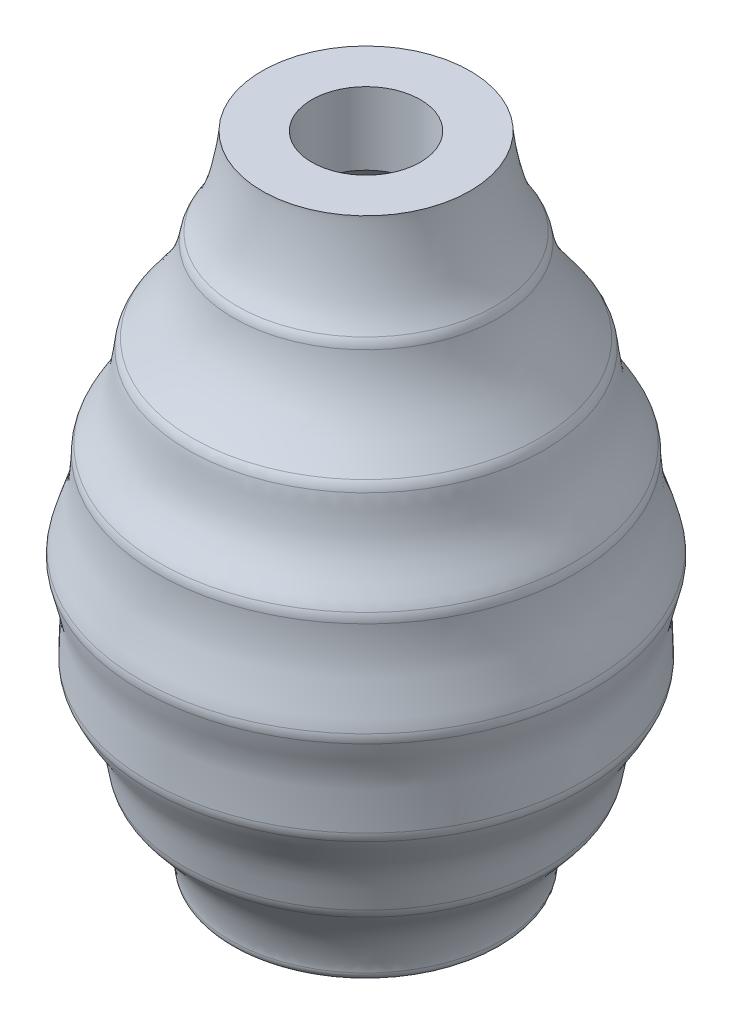
ISO-10303-21;
HEADER;
FILE_DESCRIPTION(('STEP AP214'),'2;1');
FILE_NAME('part.step','',(''),(''),'','','');
FILE_SCHEMA(('AUTOMOTIVE_DESIGN { 1 0 10303 214 1 1 1 1 }'));
ENDSEC;
DATA;
#1=APPLICATION_CONTEXT('core data for automotive mechanical design processes');
#2=APPLICATION_PROTOCOL_DEFINITION('international standard','automotive_design',2000,#1);
#3=PRODUCT_CONTEXT('',#1,'mechanical');
#4=PRODUCT('Part','Part','',(#3));
#5=PRODUCT_RELATED_PRODUCT_CATEGORY('part','',(#4));
#6=PRODUCT_DEFINITION_FORMATION('','',#4);
#7=PRODUCT_DEFINITION_CONTEXT('part definition',#1,'design');
#8=PRODUCT_DEFINITION('design','',#6,#7);
#9=PRODUCT_DEFINITION_SHAPE('','',#8);
#10=(LENGTH_UNIT() NAMED_UNIT(*) SI_UNIT(.MILLI.,.METRE.));
#11=(NAMED_UNIT(*) PLANE_ANGLE_UNIT() SI_UNIT($,.RADIAN.));
#12=(NAMED_UNIT(*) SI_UNIT($,.STERADIAN.) SOLID_ANGLE_UNIT());
#13=UNCERTAINTY_MEASURE_WITH_UNIT(LENGTH_MEASURE(1.E-05),#10,'distance_accuracy_value','');
#14=(GEOMETRIC_REPRESENTATION_CONTEXT(3) GLOBAL_UNCERTAINTY_ASSIGNED_CONTEXT((#13)) GLOBAL_UNIT_ASSIGNED_CONTEXT((#10,
#11,#12)) REPRESENTATION_CONTEXT('',''));
#15=CARTESIAN_POINT('',(0.,0.,0.));
#16=DIRECTION('',(0.,0.,1.));
#17=DIRECTION('',(1.,0.,0.));
#18=AXIS2_PLACEMENT_3D('',#15,#16,#17);
#19=CARTESIAN_POINT('',(22.225,0.,0.));
#20=DIRECTION('',(0.,-1.,0.));
#21=DIRECTION('',(1.,0.,0.));
#22=AXIS2_PLACEMENT_3D('',#19,#20,#21);
#23=PLANE('',#22);
#24=CARTESIAN_POINT('',(0.,0.,0.));
#25=DIRECTION('',(0.,-1.,0.));
#26=DIRECTION('',(1.,0.,0.));
#27=AXIS2_PLACEMENT_3D('',#24,#25,#26);
#28=CIRCLE('',#27,22.225);
#29=CARTESIAN_POINT('',(22.225,0.,0.));
#30=VERTEX_POINT('',#29);
#31=EDGE_CURVE('E86',#30,#30,#28,.T.);
#32=ORIENTED_EDGE('',*,*,#31,.T.);
#33=EDGE_LOOP('',(#32));
#34=FACE_BOUND('',#33,.T.);
#35=ADVANCED_FACE('F37',(#34),#23,.T.);
#36=CARTESIAN_POINT('',(0.,112.7125,0.));
#37=DIRECTION('',(0.,1.,0.));
#38=DIRECTION('',(-1.,0.,0.));
#39=AXIS2_PLACEMENT_3D('',#36,#37,#38);
#40=PLANE('',#39);
#41=CARTESIAN_POINT('',(0.,112.7125,0.));
#42=DIRECTION('',(0.,-1.,0.));
#43=DIRECTION('',(1.,0.,0.));
#44=AXIS2_PLACEMENT_3D('',#41,#42,#43);
#45=CIRCLE('',#44,9.525);
#46=CARTESIAN_POINT('',(9.525,112.7125,0.));
#47=VERTEX_POINT('',#46);
#48=EDGE_CURVE('E117',#47,#47,#45,.T.);
#49=ORIENTED_EDGE('',*,*,#48,.T.);
#50=EDGE_LOOP('',(#49));
#51=FACE_BOUND('',#50,.T.);
#52=CARTESIAN_POINT('',(0.,112.7125,0.));
#53=DIRECTION('',(0.,-1.,0.));
#54=DIRECTION('',(1.,0.,0.));
#55=AXIS2_PLACEMENT_3D('',#52,#53,#54);
#56=CIRCLE('',#55,18.25625);
#57=CARTESIAN_POINT('',(18.25625,112.7125,0.));
#58=VERTEX_POINT('',#57);
#59=EDGE_CURVE('E10',#58,#58,#56,.T.);
#60=ORIENTED_EDGE('',*,*,#59,.F.);
#61=EDGE_LOOP('',(#60));
#62=FACE_BOUND('',#61,.T.);
#63=ADVANCED_FACE('F106',(#51,#62),#40,.T.);
#64=CARTESIAN_POINT('',(22.61743,97.3727142857143,0.));
#65=CARTESIAN_POINT('',(22.2739002495277,97.8899345239673,0.));
#66=CARTESIAN_POINT('',(19.3414958290473,102.408033413121,0.));
#67=CARTESIAN_POINT('',(18.25625,111.664430702167,0.));
#68=CARTESIAN_POINT('',(18.25625,112.7125,0.));
#69=B_SPLINE_CURVE_WITH_KNOTS('',3,(#64,#65,#66,#67,#68),.UNSPECIFIED.,.F.,.F.,(4,1,4),(0.,
0.127387397563977,1.),.UNSPECIFIED.);
#70=CARTESIAN_POINT('',(0.,64.4071428571429,0.));
#71=DIRECTION('',(0.,-1.,0.));
#72=AXIS1_PLACEMENT('',#70,#71);
#73=SURFACE_OF_REVOLUTION('',#69,#72);
#74=ORIENTED_EDGE('',*,*,#59,.T.);
#75=EDGE_LOOP('',(#74));
#76=FACE_BOUND('',#75,.T.);
#77=CARTESIAN_POINT('',(0.,97.3727142857143,0.));
#78=DIRECTION('',(0.,-1.,0.));
#79=DIRECTION('',(1.,0.,0.));
#80=AXIS2_PLACEMENT_3D('',#77,#78,#79);
#81=CIRCLE('',#80,22.61743);
#82=CARTESIAN_POINT('',(22.61743,97.3727142857143,0.));
#83=VERTEX_POINT('',#82);
#84=EDGE_CURVE('E43',#83,#83,#81,.T.);
#85=ORIENTED_EDGE('',*,*,#84,.F.);
#86=EDGE_LOOP('',(#85));
#87=FACE_BOUND('',#86,.T.);
#88=ADVANCED_FACE('F102',(#76,#87),#73,.F.);
#89=CARTESIAN_POINT('',(0.,95.2647631360682,0.));
#90=DIRECTION('',(0.,-1.,0.));
#91=DIRECTION('',(1.,0.,0.));
#92=AXIS2_PLACEMENT_3D('',#89,#90,#91);
#93=TOROIDAL_SURFACE('',#92,19.4436874221109,3.81);
#94=ORIENTED_EDGE('',*,*,#84,.T.);
#95=EDGE_LOOP('',(#94));
#96=FACE_BOUND('',#95,.T.);
#97=CARTESIAN_POINT('',(0.,95.8487142857143,0.));
#98=DIRECTION('',(0.,-1.,0.));
#99=DIRECTION('',(1.,0.,0.));
#100=AXIS2_PLACEMENT_3D('',#97,#98,#99);
#101=CIRCLE('',#100,23.2086709618926);
#102=CARTESIAN_POINT('',(23.2086709618926,95.8487142857143,0.));
#103=VERTEX_POINT('',#102);
#104=EDGE_CURVE('E47',#103,#103,#101,.T.);
#105=ORIENTED_EDGE('',*,*,#104,.F.);
#106=EDGE_LOOP('',(#105));
#107=FACE_BOUND('',#106,.T.);
#108=ADVANCED_FACE('F105',(#96,#107),#93,.T.);
#109=CARTESIAN_POINT('',(30.4913686036452,81.2709285714286,0.));
#110=CARTESIAN_POINT('',(28.5022881798985,83.8865324154567,0.));
#111=CARTESIAN_POINT('',(25.3853801240736,88.0063045914553,0.));
#112=CARTESIAN_POINT('',(23.6405648947969,93.0641088451702,0.));
#113=CARTESIAN_POINT('',(23.2086709618926,95.8487142857143,0.));
#114=B_SPLINE_CURVE_WITH_KNOTS('',3,(#109,#110,#111,#112,#113),.UNSPECIFIED.,.F.,.F.,(4,1,4),
(0.,0.534636970288245,1.),.UNSPECIFIED.);
#115=CARTESIAN_POINT('',(0.,64.4071428571429,0.));
#116=DIRECTION('',(0.,-1.,0.));
#117=AXIS1_PLACEMENT('',#115,#116);
#118=SURFACE_OF_REVOLUTION('',#114,#117);
#119=ORIENTED_EDGE('',*,*,#104,.T.);
#120=EDGE_LOOP('',(#119));
#121=FACE_BOUND('',#120,.T.);
#122=CARTESIAN_POINT('',(0.,81.2709285714286,0.));
#123=DIRECTION('',(0.,-1.,0.));
#124=DIRECTION('',(1.,0.,0.));
#125=AXIS2_PLACEMENT_3D('',#122,#123,#124);
#126=CIRCLE('',#125,30.4913686036452);
#127=CARTESIAN_POINT('',(30.4913686036452,81.2709285714286,0.));
#128=VERTEX_POINT('',#127);
#129=EDGE_CURVE('E51',#128,#128,#126,.T.);
#130=ORIENTED_EDGE('',*,*,#129,.F.);
#131=EDGE_LOOP('',(#130));
#132=FACE_BOUND('',#131,.T.);
#133=ADVANCED_FACE('F197',(#121,#132),#118,.F.);
#134=CARTESIAN_POINT('',(0.,78.9646636755332,0.));
#135=DIRECTION('',(0.,-1.,0.));
#136=DIRECTION('',(1.,0.,0.));
#137=AXIS2_PLACEMENT_3D('',#134,#135,#136);
#138=TOROIDAL_SURFACE('',#137,27.4586730650261,3.81);
#139=ORIENTED_EDGE('',*,*,#129,.T.);
#140=EDGE_LOOP('',(#139));
#141=FACE_BOUND('',#140,.T.);
#142=CARTESIAN_POINT('',(0.,79.7469285714286,0.));
#143=DIRECTION('',(0.,-1.,0.));
#144=DIRECTION('',(1.,0.,0.));
#145=AXIS2_PLACEMENT_3D('',#142,#143,#144);
#146=CIRCLE('',#145,31.1875015181263);
#147=CARTESIAN_POINT('',(31.1875015181263,79.7469285714286,0.));
#148=VERTEX_POINT('',#147);
#149=EDGE_CURVE('E56',#148,#148,#146,.T.);
#150=ORIENTED_EDGE('',*,*,#149,.F.);
#151=EDGE_LOOP('',(#150));
#152=FACE_BOUND('',#151,.T.);
#153=ADVANCED_FACE('F194',(#141,#152),#138,.T.);
#154=CARTESIAN_POINT('',(36.2771716502344,65.1691428571428,0.));
#155=CARTESIAN_POINT('',(35.5912580419284,66.7718286541423,0.));
#156=CARTESIAN_POINT('',(31.6305612757558,71.695814800361,0.));
#157=CARTESIAN_POINT('',(31.4882405595932,78.3133933320691,0.));
#158=CARTESIAN_POINT('',(31.1875015181263,79.7469285714286,0.));
#159=B_SPLINE_CURVE_WITH_KNOTS('',3,(#154,#155,#156,#157,#158),.UNSPECIFIED.,.F.,.F.,(4,1,4),
(0.,0.545650178722927,1.),.UNSPECIFIED.);
#160=CARTESIAN_POINT('',(0.,64.4071428571429,0.));
#161=DIRECTION('',(0.,-1.,0.));
#162=AXIS1_PLACEMENT('',#160,#161);
#163=SURFACE_OF_REVOLUTION('',#159,#162);
#164=ORIENTED_EDGE('',*,*,#149,.T.);
#165=EDGE_LOOP('',(#164));
#166=FACE_BOUND('',#165,.T.);
#167=CARTESIAN_POINT('',(0.,65.1691428571428,0.));
#168=DIRECTION('',(0.,-1.,0.));
#169=DIRECTION('',(1.,0.,0.));
#170=AXIS2_PLACEMENT_3D('',#167,#168,#169);
#171=CIRCLE('',#170,36.2771716502344);
#172=CARTESIAN_POINT('',(36.2771716502344,65.1691428571428,0.));
#173=VERTEX_POINT('',#172);
#174=EDGE_CURVE('E59',#173,#173,#171,.T.);
#175=ORIENTED_EDGE('',*,*,#174,.F.);
#176=EDGE_LOOP('',(#175));
#177=FACE_BOUND('',#176,.T.);
#178=ADVANCED_FACE('F190',(#166,#177),#163,.F.);
#179=CARTESIAN_POINT('',(0.,63.6700677836736,0.));
#180=DIRECTION('',(0.,-1.,0.));
#181=DIRECTION('',(1.,0.,0.));
#182=AXIS2_PLACEMENT_3D('',#179,#180,#181);
#183=TOROIDAL_SURFACE('',#182,32.7744764131201,3.81);
#184=ORIENTED_EDGE('',*,*,#174,.T.);
#185=EDGE_LOOP('',(#184));
#186=FACE_BOUND('',#185,.T.);
#187=CARTESIAN_POINT('',(0.,63.6451428571428,0.));
#188=DIRECTION('',(0.,-1.,0.));
#189=DIRECTION('',(1.,0.,0.));
#190=AXIS2_PLACEMENT_3D('',#187,#188,#189);
#191=CIRCLE('',#190,36.5843948831188);
#192=CARTESIAN_POINT('',(36.5843948831188,63.6451428571428,0.));
#193=VERTEX_POINT('',#192);
#194=EDGE_CURVE('E62',#193,#193,#191,.T.);
#195=ORIENTED_EDGE('',*,*,#194,.F.);
#196=EDGE_LOOP('',(#195));
#197=FACE_BOUND('',#196,.T.);
#198=ADVANCED_FACE('F186',(#186,#197),#183,.T.);
#199=CARTESIAN_POINT('',(39.6061595678259,49.0673571428571,0.));
#200=CARTESIAN_POINT('',(39.0473316935015,51.7272585641019,0.));
#201=CARTESIAN_POINT('',(36.8918189623597,55.9924833531759,0.));
#202=CARTESIAN_POINT('',(36.5725777694034,61.8388290150173,0.));
#203=CARTESIAN_POINT('',(36.5843948831188,63.6451428571428,0.));
#204=B_SPLINE_CURVE_WITH_KNOTS('',3,(#199,#200,#201,#202,#203),.UNSPECIFIED.,.F.,.F.,(4,1,4),
(0.,0.539698329696632,1.),.UNSPECIFIED.);
#205=CARTESIAN_POINT('',(0.,64.4071428571429,0.));
#206=DIRECTION('',(0.,-1.,0.));
#207=AXIS1_PLACEMENT('',#205,#206);
#208=SURFACE_OF_REVOLUTION('',#204,#207);
#209=ORIENTED_EDGE('',*,*,#194,.T.);
#210=EDGE_LOOP('',(#209));
#211=FACE_BOUND('',#210,.T.);
#212=CARTESIAN_POINT('',(0.,49.0673571428571,0.));
#213=DIRECTION('',(0.,-1.,0.));
#214=DIRECTION('',(1.,0.,0.));
#215=AXIS2_PLACEMENT_3D('',#212,#213,#214);
#216=CIRCLE('',#215,39.6061595678259);
#217=CARTESIAN_POINT('',(39.6061595678259,49.0673571428571,0.));
#218=VERTEX_POINT('',#217);
#219=EDGE_CURVE('E65',#218,#218,#216,.T.);
#220=ORIENTED_EDGE('',*,*,#219,.F.);
#221=EDGE_LOOP('',(#220));
#222=FACE_BOUND('',#221,.T.);
#223=ADVANCED_FACE('F183',(#211,#222),#208,.F.);
#224=CARTESIAN_POINT('',(0.,48.2840027519536,0.));
#225=DIRECTION('',(0.,-1.,0.));
#226=DIRECTION('',(1.,0.,0.));
#227=AXIS2_PLACEMENT_3D('',#224,#225,#226);
#228=TOROIDAL_SURFACE('',#227,35.8775598443034,3.81);
#229=ORIENTED_EDGE('',*,*,#219,.T.);
#230=EDGE_LOOP('',(#229));
#231=FACE_BOUND('',#230,.T.);
#232=CARTESIAN_POINT('',(0.,47.5433571428571,0.));
#233=DIRECTION('',(0.,-1.,0.));
#234=DIRECTION('',(1.,0.,0.));
#235=AXIS2_PLACEMENT_3D('',#232,#233,#234);
#236=CIRCLE('',#235,39.6148776099913);
#237=CARTESIAN_POINT('',(39.6148776099913,47.5433571428571,0.));
#238=VERTEX_POINT('',#237);
#239=EDGE_CURVE('E68',#238,#238,#236,.T.);
#240=ORIENTED_EDGE('',*,*,#239,.F.);
#241=EDGE_LOOP('',(#240));
#242=FACE_BOUND('',#241,.T.);
#243=ADVANCED_FACE('F164',(#231,#242),#228,.T.);
#244=CARTESIAN_POINT('',(38.1685765667326,32.9655714285714,0.));
#245=CARTESIAN_POINT('',(38.1351911929782,36.051002924629,0.));
#246=CARTESIAN_POINT('',(37.396467453245,40.761008431019,0.));
#247=CARTESIAN_POINT('',(39.2047652935922,45.4739193075668,0.));
#248=CARTESIAN_POINT('',(39.6148776099913,47.5433571428571,0.));
#249=B_SPLINE_CURVE_WITH_KNOTS('',3,(#244,#245,#246,#247,#248),.UNSPECIFIED.,.F.,.F.,(4,1,4),
(0.,0.578320792083335,1.),.UNSPECIFIED.);
#250=CARTESIAN_POINT('',(0.,64.4071428571429,0.));
#251=DIRECTION('',(0.,-1.,0.));
#252=AXIS1_PLACEMENT('',#250,#251);
#253=SURFACE_OF_REVOLUTION('',#249,#252);
#254=ORIENTED_EDGE('',*,*,#239,.T.);
#255=EDGE_LOOP('',(#254));
#256=FACE_BOUND('',#255,.T.);
#257=CARTESIAN_POINT('',(0.,32.9655714285714,0.));
#258=DIRECTION('',(0.,-1.,0.));
#259=DIRECTION('',(1.,0.,0.));
#260=AXIS2_PLACEMENT_3D('',#257,#258,#259);
#261=CIRCLE('',#260,38.1685765667326);
#262=CARTESIAN_POINT('',(38.1685765667326,32.9655714285714,0.));
#263=VERTEX_POINT('',#262);
#264=EDGE_CURVE('E71',#263,#263,#261,.T.);
#265=ORIENTED_EDGE('',*,*,#264,.F.);
#266=EDGE_LOOP('',(#265));
#267=FACE_BOUND('',#266,.T.);
#268=ADVANCED_FACE('F160',(#256,#267),#253,.F.);
#269=CARTESIAN_POINT('',(0.,32.9243484007158,0.));
#270=DIRECTION('',(0.,-1.,0.));
#271=DIRECTION('',(1.,0.,0.));
#272=AXIS2_PLACEMENT_3D('',#269,#270,#271);
#273=TOROIDAL_SURFACE('',#272,34.3587995834991,3.81);
#274=ORIENTED_EDGE('',*,*,#264,.T.);
#275=EDGE_LOOP('',(#274));
#276=FACE_BOUND('',#275,.T.);
#277=CARTESIAN_POINT('',(0.,31.4415714285714,0.));
#278=DIRECTION('',(0.,-1.,0.));
#279=DIRECTION('',(1.,0.,0.));
#280=AXIS2_PLACEMENT_3D('',#277,#278,#279);
#281=CIRCLE('',#280,37.8684252687935);
#282=CARTESIAN_POINT('',(37.8684252687935,31.4415714285714,0.));
#283=VERTEX_POINT('',#282);
#284=EDGE_CURVE('E74',#283,#283,#281,.T.);
#285=ORIENTED_EDGE('',*,*,#284,.F.);
#286=EDGE_LOOP('',(#285));
#287=FACE_BOUND('',#286,.T.);
#288=ADVANCED_FACE('F156',(#276,#287),#273,.T.);
#289=CARTESIAN_POINT('',(31.9719824214806,16.8637857142857,0.));
#290=CARTESIAN_POINT('',(32.4258423793771,19.3703985444689,0.));
#291=CARTESIAN_POINT('',(33.2404314377401,24.9012869661944,0.));
#292=CARTESIAN_POINT('',(36.69304027224,28.6595202829801,0.));
#293=CARTESIAN_POINT('',(37.8684252687934,31.4415714285714,0.));
#294=B_SPLINE_CURVE_WITH_KNOTS('',3,(#289,#290,#291,#292,#293),.UNSPECIFIED.,.F.,.F.,(4,1,4),
(0.,0.482838746587029,1.),.UNSPECIFIED.);
#295=CARTESIAN_POINT('',(0.,64.4071428571429,0.));
#296=DIRECTION('',(0.,-1.,0.));
#297=AXIS1_PLACEMENT('',#295,#296);
#298=SURFACE_OF_REVOLUTION('',#294,#297);
#299=ORIENTED_EDGE('',*,*,#284,.T.);
#300=EDGE_LOOP('',(#299));
#301=FACE_BOUND('',#300,.T.);
#302=CARTESIAN_POINT('',(0.,16.8637857142857,0.));
#303=DIRECTION('',(0.,-1.,0.));
#304=DIRECTION('',(1.,0.,0.));
#305=AXIS2_PLACEMENT_3D('',#302,#303,#304);
#306=CIRCLE('',#305,31.9719824214806);
#307=CARTESIAN_POINT('',(31.9719824214806,16.8637857142857,0.));
#308=VERTEX_POINT('',#307);
#309=EDGE_CURVE('E77',#308,#308,#306,.T.);
#310=ORIENTED_EDGE('',*,*,#309,.F.);
#311=EDGE_LOOP('',(#310));
#312=FACE_BOUND('',#311,.T.);
#313=ADVANCED_FACE('F152',(#301,#312),#298,.F.);
#314=CARTESIAN_POINT('',(0.,17.5426058555274,0.));
#315=DIRECTION('',(0.,-1.,0.));
#316=DIRECTION('',(1.,0.,0.));
#317=AXIS2_PLACEMENT_3D('',#314,#315,#316);
#318=TOROIDAL_SURFACE('',#317,28.222942115503,3.81);
#319=ORIENTED_EDGE('',*,*,#309,.T.);
#320=EDGE_LOOP('',(#319));
#321=FACE_BOUND('',#320,.T.);
#322=CARTESIAN_POINT('',(0.,15.3397857142857,0.));
#323=DIRECTION('',(0.,-1.,0.));
#324=DIRECTION('',(1.,0.,0.));
#325=AXIS2_PLACEMENT_3D('',#322,#323,#324);
#326=CIRCLE('',#325,31.3315886739493);
#327=CARTESIAN_POINT('',(31.3315886739493,15.3397857142857,0.));
#328=VERTEX_POINT('',#327);
#329=EDGE_CURVE('E80',#328,#328,#326,.T.);
#330=ORIENTED_EDGE('',*,*,#329,.F.);
#331=EDGE_LOOP('',(#330));
#332=FACE_BOUND('',#331,.T.);
#333=ADVANCED_FACE('F147',(#321,#332),#318,.T.);
#334=CARTESIAN_POINT('',(23.749,1.524,0.));
#335=CARTESIAN_POINT('',(23.749,2.47608523728183,0.));
#336=CARTESIAN_POINT('',(25.3992725168856,9.84810409618061,0.));
#337=CARTESIAN_POINT('',(29.6442811697261,12.9586368552203,0.));
#338=CARTESIAN_POINT('',(31.3315886739493,15.3397857142857,0.));
#339=B_SPLINE_CURVE_WITH_KNOTS('',3,(#334,#335,#336,#337,#338),.UNSPECIFIED.,.F.,.F.,(4,1,4),
(0.,0.352009342196214,1.),.UNSPECIFIED.);
#340=CARTESIAN_POINT('',(0.,64.4071428571429,0.));
#341=DIRECTION('',(0.,-1.,0.));
#342=AXIS1_PLACEMENT('',#340,#341);
#343=SURFACE_OF_REVOLUTION('',#339,#342);
#344=ORIENTED_EDGE('',*,*,#329,.T.);
#345=EDGE_LOOP('',(#344));
#346=FACE_BOUND('',#345,.T.);
#347=CARTESIAN_POINT('',(0.,1.524,0.));
#348=DIRECTION('',(0.,-1.,0.));
#349=DIRECTION('',(1.,0.,0.));
#350=AXIS2_PLACEMENT_3D('',#347,#348,#349);
#351=CIRCLE('',#350,23.749);
#352=CARTESIAN_POINT('',(23.749,1.524,0.));
#353=VERTEX_POINT('',#352);
#354=EDGE_CURVE('E83',#353,#353,#351,.T.);
#355=ORIENTED_EDGE('',*,*,#354,.F.);
#356=EDGE_LOOP('',(#355));
#357=FACE_BOUND('',#356,.T.);
#358=ADVANCED_FACE('F142',(#346,#357),#343,.F.);
#359=CARTESIAN_POINT('',(0.,1.524,0.));
#360=DIRECTION('',(0.,-1.,0.));
#361=DIRECTION('',(1.,0.,0.));
#362=AXIS2_PLACEMENT_3D('',#359,#360,#361);
#363=TOROIDAL_SURFACE('',#362,22.225,1.524);
#364=ORIENTED_EDGE('',*,*,#354,.T.);
#365=EDGE_LOOP('',(#364));
#366=FACE_BOUND('',#365,.T.);
#367=ORIENTED_EDGE('',*,*,#31,.F.);
#368=EDGE_LOOP('',(#367));
#369=FACE_BOUND('',#368,.T.);
#370=ADVANCED_FACE('F146',(#366,#369),#363,.T.);
#371=CARTESIAN_POINT('',(17.78,6.34999999999999,0.));
#372=DIRECTION('',(0.,-1.,0.));
#373=DIRECTION('',(1.,0.,0.));
#374=AXIS2_PLACEMENT_3D('',#371,#372,#373);
#375=PLANE('',#374);
#376=CARTESIAN_POINT('',(0.,6.34999999999999,0.));
#377=DIRECTION('',(0.,-1.,0.));
#378=DIRECTION('',(1.,0.,0.));
#379=AXIS2_PLACEMENT_3D('',#376,#377,#378);
#380=CIRCLE('',#379,17.78);
#381=CARTESIAN_POINT('',(17.78,6.34999999999999,0.));
#382=VERTEX_POINT('',#381);
#383=EDGE_CURVE('E89',#382,#382,#380,.T.);
#384=ORIENTED_EDGE('',*,*,#383,.F.);
#385=EDGE_LOOP('',(#384));
#386=FACE_BOUND('',#385,.T.);
#387=ADVANCED_FACE('F232',(#386),#375,.F.);
#388=CARTESIAN_POINT('',(17.78,6.34999999999999,0.));
#389=CARTESIAN_POINT('',(48.0926136461911,54.9090355869304,0.));
#390=CARTESIAN_POINT('',(9.525,100.0125,0.));
#391=B_SPLINE_CURVE_WITH_KNOTS('',2,(#388,#389,#390),.UNSPECIFIED.,.F.,.F.,(3,3),(0.,1.),.UNSPECIFIED.);
#392=CARTESIAN_POINT('',(0.,64.4071428571429,0.));
#393=DIRECTION('',(0.,-1.,0.));
#394=AXIS1_PLACEMENT('',#392,#393);
#395=SURFACE_OF_REVOLUTION('',#391,#394);
#396=CARTESIAN_POINT('',(0.,100.0125,0.));
#397=DIRECTION('',(0.,-1.,0.));
#398=DIRECTION('',(1.,0.,0.));
#399=AXIS2_PLACEMENT_3D('',#396,#397,#398);
#400=CIRCLE('',#399,9.525);
#401=CARTESIAN_POINT('',(9.525,100.0125,0.));
#402=VERTEX_POINT('',#401);
#403=EDGE_CURVE('E119',#402,#402,#400,.T.);
#404=ORIENTED_EDGE('',*,*,#403,.F.);
#405=EDGE_LOOP('',(#404));
#406=FACE_BOUND('',#405,.T.);
#407=ORIENTED_EDGE('',*,*,#383,.T.);
#408=EDGE_LOOP('',(#407));
#409=FACE_BOUND('',#408,.T.);
#410=ADVANCED_FACE('F237',(#406,#409),#395,.T.);
#411=CARTESIAN_POINT('',(0.,64.4071428571429,0.));
#412=DIRECTION('',(0.,-1.,0.));
#413=DIRECTION('',(1.,0.,0.));
#414=AXIS2_PLACEMENT_3D('',#411,#412,#413);
#415=CYLINDRICAL_SURFACE('',#414,9.525);
#416=ORIENTED_EDGE('',*,*,#48,.F.);
#417=EDGE_LOOP('',(#416));
#418=FACE_BOUND('',#417,.T.);
#419=ORIENTED_EDGE('',*,*,#403,.T.);
#420=EDGE_LOOP('',(#419));
#421=FACE_BOUND('',#420,.T.);
#422=ADVANCED_FACE('F242',(#418,#421),#415,.F.);
#423=CLOSED_SHELL('',(#35,#63,#88,#108,#133,#153,#178,#198,#223,#243,#268,#288,#313,#333,#358,
#370,#387,#410,#422));
#424=MANIFOLD_SOLID_BREP('B2',#423);
#425=ADVANCED_BREP_SHAPE_REPRESENTATION('',(#18,#424),#14);
#426=SHAPE_DEFINITION_REPRESENTATION(#9,#425);
ENDSEC;
END-ISO-10303-21;
